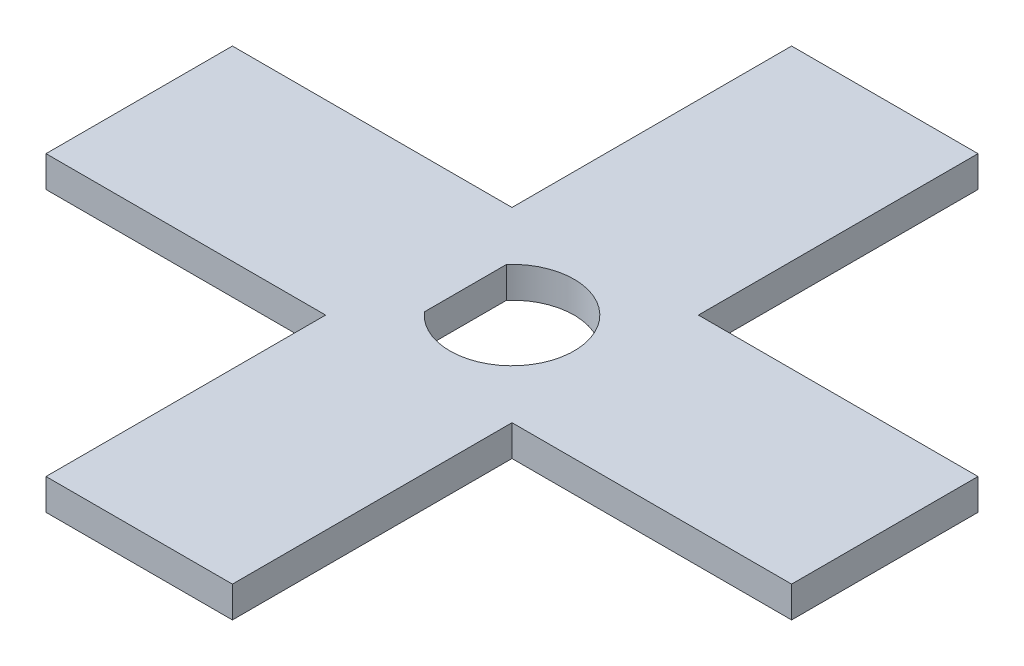
ISO-10303-21;
HEADER;
FILE_DESCRIPTION(('STEP AP214'),'2;1');
FILE_NAME('part.step','',(''),(''),'','','');
FILE_SCHEMA(('AUTOMOTIVE_DESIGN { 1 0 10303 214 1 1 1 1 }'));
ENDSEC;
DATA;
#1=APPLICATION_CONTEXT('core data for automotive mechanical design processes');
#2=APPLICATION_PROTOCOL_DEFINITION('international standard','automotive_design',2000,#1);
#3=PRODUCT_CONTEXT('',#1,'mechanical');
#4=PRODUCT('Part','Part','',(#3));
#5=PRODUCT_RELATED_PRODUCT_CATEGORY('part','',(#4));
#6=PRODUCT_DEFINITION_FORMATION('','',#4);
#7=PRODUCT_DEFINITION_CONTEXT('part definition',#1,'design');
#8=PRODUCT_DEFINITION('design','',#6,#7);
#9=PRODUCT_DEFINITION_SHAPE('','',#8);
#10=(LENGTH_UNIT() NAMED_UNIT(*) SI_UNIT(.MILLI.,.METRE.));
#11=(NAMED_UNIT(*) PLANE_ANGLE_UNIT() SI_UNIT($,.RADIAN.));
#12=(NAMED_UNIT(*) SI_UNIT($,.STERADIAN.) SOLID_ANGLE_UNIT());
#13=UNCERTAINTY_MEASURE_WITH_UNIT(LENGTH_MEASURE(1.E-05),#10,'distance_accuracy_value','');
#14=(GEOMETRIC_REPRESENTATION_CONTEXT(3) GLOBAL_UNCERTAINTY_ASSIGNED_CONTEXT((#13)) GLOBAL_UNIT_ASSIGNED_CONTEXT((#10,
#11,#12)) REPRESENTATION_CONTEXT('',''));
#15=CARTESIAN_POINT('',(0.,0.,0.));
#16=DIRECTION('',(0.,0.,1.));
#17=DIRECTION('',(1.,0.,0.));
#18=AXIS2_PLACEMENT_3D('',#15,#16,#17);
#19=CARTESIAN_POINT('',(0.,2.,0.));
#20=DIRECTION('',(0.,-1.,0.));
#21=DIRECTION('',(0.,0.,-1.));
#22=AXIS2_PLACEMENT_3D('',#19,#20,#21);
#23=PLANE('',#22);
#24=DIRECTION('',(0.,0.,1.));
#25=VECTOR('',#24,1.);
#26=CARTESIAN_POINT('',(24.,2.,-6.));
#27=LINE('',#26,#25);
#28=CARTESIAN_POINT('',(24.,2.,-6.));
#29=VERTEX_POINT('',#28);
#30=CARTESIAN_POINT('',(24.,2.,6.));
#31=VERTEX_POINT('',#30);
#32=EDGE_CURVE('E164',#29,#31,#27,.T.);
#33=ORIENTED_EDGE('',*,*,#32,.F.);
#34=DIRECTION('',(1.,0.,0.));
#35=VECTOR('',#34,1.);
#36=CARTESIAN_POINT('',(6.00000000000001,2.,-6.));
#37=LINE('',#36,#35);
#38=CARTESIAN_POINT('',(6.00000000000001,2.,-6.));
#39=VERTEX_POINT('',#38);
#40=EDGE_CURVE('E209',#39,#29,#37,.T.);
#41=ORIENTED_EDGE('',*,*,#40,.F.);
#42=DIRECTION('',(0.,0.,1.));
#43=VECTOR('',#42,1.);
#44=CARTESIAN_POINT('',(6.,2.,-24.));
#45=LINE('',#44,#43);
#46=CARTESIAN_POINT('',(6.,2.,-24.));
#47=VERTEX_POINT('',#46);
#48=EDGE_CURVE('E205',#47,#39,#45,.T.);
#49=ORIENTED_EDGE('',*,*,#48,.F.);
#50=DIRECTION('',(1.,0.,0.));
#51=VECTOR('',#50,1.);
#52=CARTESIAN_POINT('',(-6.,2.,-24.));
#53=LINE('',#52,#51);
#54=CARTESIAN_POINT('',(-6.,2.,-24.));
#55=VERTEX_POINT('',#54);
#56=EDGE_CURVE('E201',#55,#47,#53,.T.);
#57=ORIENTED_EDGE('',*,*,#56,.F.);
#58=DIRECTION('',(0.,0.,-1.));
#59=VECTOR('',#58,1.);
#60=CARTESIAN_POINT('',(-6.,2.,-6.));
#61=LINE('',#60,#59);
#62=CARTESIAN_POINT('',(-6.,2.,-6.));
#63=VERTEX_POINT('',#62);
#64=EDGE_CURVE('E197',#63,#55,#61,.T.);
#65=ORIENTED_EDGE('',*,*,#64,.F.);
#66=DIRECTION('',(1.,0.,0.));
#67=VECTOR('',#66,1.);
#68=CARTESIAN_POINT('',(-24.,2.,-6.));
#69=LINE('',#68,#67);
#70=CARTESIAN_POINT('',(-24.,2.,-6.));
#71=VERTEX_POINT('',#70);
#72=EDGE_CURVE('E193',#71,#63,#69,.T.);
#73=ORIENTED_EDGE('',*,*,#72,.F.);
#74=DIRECTION('',(0.,0.,-1.));
#75=VECTOR('',#74,1.);
#76=CARTESIAN_POINT('',(-24.,2.,6.));
#77=LINE('',#76,#75);
#78=CARTESIAN_POINT('',(-24.,2.,6.));
#79=VERTEX_POINT('',#78);
#80=EDGE_CURVE('E189',#79,#71,#77,.T.);
#81=ORIENTED_EDGE('',*,*,#80,.F.);
#82=DIRECTION('',(-1.,0.,0.));
#83=VECTOR('',#82,1.);
#84=CARTESIAN_POINT('',(-6.,2.,5.99999999999999));
#85=LINE('',#84,#83);
#86=CARTESIAN_POINT('',(-6.,2.,5.99999999999999));
#87=VERTEX_POINT('',#86);
#88=EDGE_CURVE('E185',#87,#79,#85,.T.);
#89=ORIENTED_EDGE('',*,*,#88,.F.);
#90=DIRECTION('',(0.,0.,-1.));
#91=VECTOR('',#90,1.);
#92=CARTESIAN_POINT('',(-5.99999999999999,2.,24.));
#93=LINE('',#92,#91);
#94=CARTESIAN_POINT('',(-5.99999999999999,2.,24.));
#95=VERTEX_POINT('',#94);
#96=EDGE_CURVE('E181',#95,#87,#93,.T.);
#97=ORIENTED_EDGE('',*,*,#96,.F.);
#98=DIRECTION('',(-1.,0.,0.));
#99=VECTOR('',#98,1.);
#100=CARTESIAN_POINT('',(6.00000000000001,2.,24.));
#101=LINE('',#100,#99);
#102=CARTESIAN_POINT('',(6.00000000000001,2.,24.));
#103=VERTEX_POINT('',#102);
#104=EDGE_CURVE('E177',#103,#95,#101,.T.);
#105=ORIENTED_EDGE('',*,*,#104,.F.);
#106=DIRECTION('',(0.,0.,1.));
#107=VECTOR('',#106,1.);
#108=CARTESIAN_POINT('',(6.00000000000001,2.,6.));
#109=LINE('',#108,#107);
#110=CARTESIAN_POINT('',(6.00000000000001,2.,6.));
#111=VERTEX_POINT('',#110);
#112=EDGE_CURVE('E173',#111,#103,#109,.T.);
#113=ORIENTED_EDGE('',*,*,#112,.F.);
#114=DIRECTION('',(-1.,0.,0.));
#115=VECTOR('',#114,1.);
#116=CARTESIAN_POINT('',(24.,2.,6.));
#117=LINE('',#116,#115);
#118=EDGE_CURVE('E168',#31,#111,#117,.T.);
#119=ORIENTED_EDGE('',*,*,#118,.F.);
#120=EDGE_LOOP('',(#33,#41,#49,#57,#65,#73,#81,#89,#97,#105,#113,#119));
#121=FACE_BOUND('',#120,.T.);
#122=CARTESIAN_POINT('',(0.,2.,0.));
#123=DIRECTION('',(0.,1.,0.));
#124=DIRECTION('',(0.,0.,1.));
#125=AXIS2_PLACEMENT_3D('',#122,#123,#124);
#126=CIRCLE('',#125,4.);
#127=CARTESIAN_POINT('',(-3.,2.,2.64575131106459));
#128=VERTEX_POINT('',#127);
#129=CARTESIAN_POINT('',(-3.,2.,-2.64575131106459));
#130=VERTEX_POINT('',#129);
#131=EDGE_CURVE('E148',#128,#130,#126,.T.);
#132=ORIENTED_EDGE('',*,*,#131,.F.);
#133=DIRECTION('',(0.,0.,1.));
#134=VECTOR('',#133,1.);
#135=CARTESIAN_POINT('',(-3.,2.,2.64575131106459));
#136=LINE('',#135,#134);
#137=EDGE_CURVE('E141',#130,#128,#136,.T.);
#138=ORIENTED_EDGE('',*,*,#137,.F.);
#139=EDGE_LOOP('',(#132,#138));
#140=FACE_BOUND('',#139,.T.);
#141=ADVANCED_FACE('F39',(#121,#140),#23,.F.);
#142=CARTESIAN_POINT('',(0.,0.,0.));
#143=DIRECTION('',(0.,-1.,0.));
#144=DIRECTION('',(0.,0.,-1.));
#145=AXIS2_PLACEMENT_3D('',#142,#143,#144);
#146=PLANE('',#145);
#147=DIRECTION('',(0.,0.,1.));
#148=VECTOR('',#147,1.);
#149=CARTESIAN_POINT('',(24.,0.,-6.));
#150=LINE('',#149,#148);
#151=CARTESIAN_POINT('',(24.,0.,-6.));
#152=VERTEX_POINT('',#151);
#153=CARTESIAN_POINT('',(24.,0.,6.));
#154=VERTEX_POINT('',#153);
#155=EDGE_CURVE('E163',#152,#154,#150,.T.);
#156=ORIENTED_EDGE('',*,*,#155,.T.);
#157=DIRECTION('',(-1.,0.,0.));
#158=VECTOR('',#157,1.);
#159=CARTESIAN_POINT('',(24.,0.,6.));
#160=LINE('',#159,#158);
#161=CARTESIAN_POINT('',(6.00000000000001,0.,6.));
#162=VERTEX_POINT('',#161);
#163=EDGE_CURVE('E216',#154,#162,#160,.T.);
#164=ORIENTED_EDGE('',*,*,#163,.T.);
#165=DIRECTION('',(0.,0.,1.));
#166=VECTOR('',#165,1.);
#167=CARTESIAN_POINT('',(6.00000000000001,0.,6.));
#168=LINE('',#167,#166);
#169=CARTESIAN_POINT('',(6.00000000000001,0.,24.));
#170=VERTEX_POINT('',#169);
#171=EDGE_CURVE('E220',#162,#170,#168,.T.);
#172=ORIENTED_EDGE('',*,*,#171,.T.);
#173=DIRECTION('',(-1.,0.,0.));
#174=VECTOR('',#173,1.);
#175=CARTESIAN_POINT('',(6.00000000000001,0.,24.));
#176=LINE('',#175,#174);
#177=CARTESIAN_POINT('',(-5.99999999999999,0.,24.));
#178=VERTEX_POINT('',#177);
#179=EDGE_CURVE('E224',#170,#178,#176,.T.);
#180=ORIENTED_EDGE('',*,*,#179,.T.);
#181=DIRECTION('',(0.,0.,-1.));
#182=VECTOR('',#181,1.);
#183=CARTESIAN_POINT('',(-5.99999999999999,0.,24.));
#184=LINE('',#183,#182);
#185=CARTESIAN_POINT('',(-6.,0.,5.99999999999999));
#186=VERTEX_POINT('',#185);
#187=EDGE_CURVE('E228',#178,#186,#184,.T.);
#188=ORIENTED_EDGE('',*,*,#187,.T.);
#189=DIRECTION('',(-1.,0.,0.));
#190=VECTOR('',#189,1.);
#191=CARTESIAN_POINT('',(-6.,0.,5.99999999999999));
#192=LINE('',#191,#190);
#193=CARTESIAN_POINT('',(-24.,0.,6.));
#194=VERTEX_POINT('',#193);
#195=EDGE_CURVE('E232',#186,#194,#192,.T.);
#196=ORIENTED_EDGE('',*,*,#195,.T.);
#197=DIRECTION('',(0.,0.,-1.));
#198=VECTOR('',#197,1.);
#199=CARTESIAN_POINT('',(-24.,0.,6.));
#200=LINE('',#199,#198);
#201=CARTESIAN_POINT('',(-24.,0.,-6.));
#202=VERTEX_POINT('',#201);
#203=EDGE_CURVE('E236',#194,#202,#200,.T.);
#204=ORIENTED_EDGE('',*,*,#203,.T.);
#205=DIRECTION('',(1.,0.,0.));
#206=VECTOR('',#205,1.);
#207=CARTESIAN_POINT('',(-24.,0.,-6.));
#208=LINE('',#207,#206);
#209=CARTESIAN_POINT('',(-6.,0.,-6.));
#210=VERTEX_POINT('',#209);
#211=EDGE_CURVE('E240',#202,#210,#208,.T.);
#212=ORIENTED_EDGE('',*,*,#211,.T.);
#213=DIRECTION('',(0.,0.,-1.));
#214=VECTOR('',#213,1.);
#215=CARTESIAN_POINT('',(-6.,0.,-6.));
#216=LINE('',#215,#214);
#217=CARTESIAN_POINT('',(-6.,0.,-24.));
#218=VERTEX_POINT('',#217);
#219=EDGE_CURVE('E244',#210,#218,#216,.T.);
#220=ORIENTED_EDGE('',*,*,#219,.T.);
#221=DIRECTION('',(1.,0.,0.));
#222=VECTOR('',#221,1.);
#223=CARTESIAN_POINT('',(-6.,0.,-24.));
#224=LINE('',#223,#222);
#225=CARTESIAN_POINT('',(6.,0.,-24.));
#226=VERTEX_POINT('',#225);
#227=EDGE_CURVE('E248',#218,#226,#224,.T.);
#228=ORIENTED_EDGE('',*,*,#227,.T.);
#229=DIRECTION('',(0.,0.,1.));
#230=VECTOR('',#229,1.);
#231=CARTESIAN_POINT('',(6.,0.,-24.));
#232=LINE('',#231,#230);
#233=CARTESIAN_POINT('',(6.00000000000001,0.,-6.));
#234=VERTEX_POINT('',#233);
#235=EDGE_CURVE('E252',#226,#234,#232,.T.);
#236=ORIENTED_EDGE('',*,*,#235,.T.);
#237=DIRECTION('',(1.,0.,0.));
#238=VECTOR('',#237,1.);
#239=CARTESIAN_POINT('',(6.00000000000001,0.,-6.));
#240=LINE('',#239,#238);
#241=EDGE_CURVE('E169',#234,#152,#240,.T.);
#242=ORIENTED_EDGE('',*,*,#241,.T.);
#243=EDGE_LOOP('',(#156,#164,#172,#180,#188,#196,#204,#212,#220,#228,#236,#242));
#244=FACE_BOUND('',#243,.T.);
#245=DIRECTION('',(0.,0.,1.));
#246=VECTOR('',#245,1.);
#247=CARTESIAN_POINT('',(-3.,0.,2.64575131106459));
#248=LINE('',#247,#246);
#249=CARTESIAN_POINT('',(-3.,0.,-2.64575131106459));
#250=VERTEX_POINT('',#249);
#251=CARTESIAN_POINT('',(-3.,0.,2.64575131106459));
#252=VERTEX_POINT('',#251);
#253=EDGE_CURVE('E154',#250,#252,#248,.T.);
#254=ORIENTED_EDGE('',*,*,#253,.T.);
#255=CARTESIAN_POINT('',(0.,0.,0.));
#256=DIRECTION('',(0.,1.,0.));
#257=DIRECTION('',(0.,0.,1.));
#258=AXIS2_PLACEMENT_3D('',#255,#256,#257);
#259=CIRCLE('',#258,4.);
#260=EDGE_CURVE('E64',#252,#250,#259,.T.);
#261=ORIENTED_EDGE('',*,*,#260,.T.);
#262=EDGE_LOOP('',(#254,#261));
#263=FACE_BOUND('',#262,.T.);
#264=ADVANCED_FACE('F296',(#244,#263),#146,.T.);
#265=CARTESIAN_POINT('',(24.,2.,-6.));
#266=DIRECTION('',(1.,0.,0.));
#267=DIRECTION('',(0.,0.,-1.));
#268=AXIS2_PLACEMENT_3D('',#265,#266,#267);
#269=PLANE('',#268);
#270=ORIENTED_EDGE('',*,*,#155,.F.);
#271=DIRECTION('',(0.,-1.,0.));
#272=VECTOR('',#271,1.);
#273=CARTESIAN_POINT('',(24.,2.,-6.));
#274=LINE('',#273,#272);
#275=EDGE_CURVE('E11',#29,#152,#274,.T.);
#276=ORIENTED_EDGE('',*,*,#275,.F.);
#277=ORIENTED_EDGE('',*,*,#32,.T.);
#278=DIRECTION('',(0.,-1.,0.));
#279=VECTOR('',#278,1.);
#280=CARTESIAN_POINT('',(24.,2.,6.));
#281=LINE('',#280,#279);
#282=EDGE_CURVE('E43',#31,#154,#281,.T.);
#283=ORIENTED_EDGE('',*,*,#282,.T.);
#284=EDGE_LOOP('',(#270,#276,#277,#283));
#285=FACE_BOUND('',#284,.T.);
#286=ADVANCED_FACE('F41',(#285),#269,.T.);
#287=CARTESIAN_POINT('',(6.00000000000001,2.,-6.));
#288=DIRECTION('',(0.,0.,-1.));
#289=DIRECTION('',(-1.,0.,0.));
#290=AXIS2_PLACEMENT_3D('',#287,#288,#289);
#291=PLANE('',#290);
#292=ORIENTED_EDGE('',*,*,#241,.F.);
#293=DIRECTION('',(0.,-1.,0.));
#294=VECTOR('',#293,1.);
#295=CARTESIAN_POINT('',(6.00000000000001,2.,-6.));
#296=LINE('',#295,#294);
#297=EDGE_CURVE('E49',#39,#234,#296,.T.);
#298=ORIENTED_EDGE('',*,*,#297,.F.);
#299=ORIENTED_EDGE('',*,*,#40,.T.);
#300=ORIENTED_EDGE('',*,*,#275,.T.);
#301=EDGE_LOOP('',(#292,#298,#299,#300));
#302=FACE_BOUND('',#301,.T.);
#303=ADVANCED_FACE('F301',(#302),#291,.T.);
#304=CARTESIAN_POINT('',(6.,2.,-24.));
#305=DIRECTION('',(1.,0.,0.));
#306=DIRECTION('',(0.,0.,-1.));
#307=AXIS2_PLACEMENT_3D('',#304,#305,#306);
#308=PLANE('',#307);
#309=ORIENTED_EDGE('',*,*,#235,.F.);
#310=DIRECTION('',(0.,-1.,0.));
#311=VECTOR('',#310,1.);
#312=CARTESIAN_POINT('',(6.,2.,-24.));
#313=LINE('',#312,#311);
#314=EDGE_CURVE('E261',#47,#226,#313,.T.);
#315=ORIENTED_EDGE('',*,*,#314,.F.);
#316=ORIENTED_EDGE('',*,*,#48,.T.);
#317=ORIENTED_EDGE('',*,*,#297,.T.);
#318=EDGE_LOOP('',(#309,#315,#316,#317));
#319=FACE_BOUND('',#318,.T.);
#320=ADVANCED_FACE('F337',(#319),#308,.T.);
#321=CARTESIAN_POINT('',(-6.,2.,-24.));
#322=DIRECTION('',(0.,0.,-1.));
#323=DIRECTION('',(-1.,0.,0.));
#324=AXIS2_PLACEMENT_3D('',#321,#322,#323);
#325=PLANE('',#324);
#326=ORIENTED_EDGE('',*,*,#227,.F.);
#327=DIRECTION('',(0.,-1.,0.));
#328=VECTOR('',#327,1.);
#329=CARTESIAN_POINT('',(-6.,2.,-24.));
#330=LINE('',#329,#328);
#331=EDGE_CURVE('E264',#55,#218,#330,.T.);
#332=ORIENTED_EDGE('',*,*,#331,.F.);
#333=ORIENTED_EDGE('',*,*,#56,.T.);
#334=ORIENTED_EDGE('',*,*,#314,.T.);
#335=EDGE_LOOP('',(#326,#332,#333,#334));
#336=FACE_BOUND('',#335,.T.);
#337=ADVANCED_FACE('F334',(#336),#325,.T.);
#338=CARTESIAN_POINT('',(-6.,2.,-6.));
#339=DIRECTION('',(-1.,0.,0.));
#340=DIRECTION('',(0.,0.,1.));
#341=AXIS2_PLACEMENT_3D('',#338,#339,#340);
#342=PLANE('',#341);
#343=ORIENTED_EDGE('',*,*,#219,.F.);
#344=DIRECTION('',(0.,-1.,0.));
#345=VECTOR('',#344,1.);
#346=CARTESIAN_POINT('',(-6.,2.,-6.));
#347=LINE('',#346,#345);
#348=EDGE_CURVE('E267',#63,#210,#347,.T.);
#349=ORIENTED_EDGE('',*,*,#348,.F.);
#350=ORIENTED_EDGE('',*,*,#64,.T.);
#351=ORIENTED_EDGE('',*,*,#331,.T.);
#352=EDGE_LOOP('',(#343,#349,#350,#351));
#353=FACE_BOUND('',#352,.T.);
#354=ADVANCED_FACE('F331',(#353),#342,.T.);
#355=CARTESIAN_POINT('',(-24.,2.,-6.));
#356=DIRECTION('',(0.,0.,-1.));
#357=DIRECTION('',(-1.,0.,0.));
#358=AXIS2_PLACEMENT_3D('',#355,#356,#357);
#359=PLANE('',#358);
#360=ORIENTED_EDGE('',*,*,#211,.F.);
#361=DIRECTION('',(0.,-1.,0.));
#362=VECTOR('',#361,1.);
#363=CARTESIAN_POINT('',(-24.,2.,-6.));
#364=LINE('',#363,#362);
#365=EDGE_CURVE('E270',#71,#202,#364,.T.);
#366=ORIENTED_EDGE('',*,*,#365,.F.);
#367=ORIENTED_EDGE('',*,*,#72,.T.);
#368=ORIENTED_EDGE('',*,*,#348,.T.);
#369=EDGE_LOOP('',(#360,#366,#367,#368));
#370=FACE_BOUND('',#369,.T.);
#371=ADVANCED_FACE('F327',(#370),#359,.T.);
#372=CARTESIAN_POINT('',(-24.,2.,6.));
#373=DIRECTION('',(-1.,0.,0.));
#374=DIRECTION('',(0.,0.,1.));
#375=AXIS2_PLACEMENT_3D('',#372,#373,#374);
#376=PLANE('',#375);
#377=ORIENTED_EDGE('',*,*,#203,.F.);
#378=DIRECTION('',(0.,-1.,0.));
#379=VECTOR('',#378,1.);
#380=CARTESIAN_POINT('',(-24.,2.,6.));
#381=LINE('',#380,#379);
#382=EDGE_CURVE('E273',#79,#194,#381,.T.);
#383=ORIENTED_EDGE('',*,*,#382,.F.);
#384=ORIENTED_EDGE('',*,*,#80,.T.);
#385=ORIENTED_EDGE('',*,*,#365,.T.);
#386=EDGE_LOOP('',(#377,#383,#384,#385));
#387=FACE_BOUND('',#386,.T.);
#388=ADVANCED_FACE('F323',(#387),#376,.T.);
#389=CARTESIAN_POINT('',(-6.,2.,5.99999999999999));
#390=DIRECTION('',(0.,0.,1.));
#391=DIRECTION('',(1.,0.,0.));
#392=AXIS2_PLACEMENT_3D('',#389,#390,#391);
#393=PLANE('',#392);
#394=ORIENTED_EDGE('',*,*,#195,.F.);
#395=DIRECTION('',(0.,-1.,0.));
#396=VECTOR('',#395,1.);
#397=CARTESIAN_POINT('',(-6.,2.,5.99999999999999));
#398=LINE('',#397,#396);
#399=EDGE_CURVE('E276',#87,#186,#398,.T.);
#400=ORIENTED_EDGE('',*,*,#399,.F.);
#401=ORIENTED_EDGE('',*,*,#88,.T.);
#402=ORIENTED_EDGE('',*,*,#382,.T.);
#403=EDGE_LOOP('',(#394,#400,#401,#402));
#404=FACE_BOUND('',#403,.T.);
#405=ADVANCED_FACE('F319',(#404),#393,.T.);
#406=CARTESIAN_POINT('',(-5.99999999999999,2.,24.));
#407=DIRECTION('',(-1.,0.,0.));
#408=DIRECTION('',(0.,0.,1.));
#409=AXIS2_PLACEMENT_3D('',#406,#407,#408);
#410=PLANE('',#409);
#411=ORIENTED_EDGE('',*,*,#187,.F.);
#412=DIRECTION('',(0.,-1.,0.));
#413=VECTOR('',#412,1.);
#414=CARTESIAN_POINT('',(-5.99999999999999,2.,24.));
#415=LINE('',#414,#413);
#416=EDGE_CURVE('E279',#95,#178,#415,.T.);
#417=ORIENTED_EDGE('',*,*,#416,.F.);
#418=ORIENTED_EDGE('',*,*,#96,.T.);
#419=ORIENTED_EDGE('',*,*,#399,.T.);
#420=EDGE_LOOP('',(#411,#417,#418,#419));
#421=FACE_BOUND('',#420,.T.);
#422=ADVANCED_FACE('F315',(#421),#410,.T.);
#423=CARTESIAN_POINT('',(6.00000000000001,2.,24.));
#424=DIRECTION('',(0.,0.,1.));
#425=DIRECTION('',(1.,0.,0.));
#426=AXIS2_PLACEMENT_3D('',#423,#424,#425);
#427=PLANE('',#426);
#428=ORIENTED_EDGE('',*,*,#179,.F.);
#429=DIRECTION('',(0.,-1.,0.));
#430=VECTOR('',#429,1.);
#431=CARTESIAN_POINT('',(6.00000000000001,2.,24.));
#432=LINE('',#431,#430);
#433=EDGE_CURVE('E282',#103,#170,#432,.T.);
#434=ORIENTED_EDGE('',*,*,#433,.F.);
#435=ORIENTED_EDGE('',*,*,#104,.T.);
#436=ORIENTED_EDGE('',*,*,#416,.T.);
#437=EDGE_LOOP('',(#428,#434,#435,#436));
#438=FACE_BOUND('',#437,.T.);
#439=ADVANCED_FACE('F313',(#438),#427,.T.);
#440=CARTESIAN_POINT('',(6.00000000000001,2.,6.));
#441=DIRECTION('',(1.,0.,0.));
#442=DIRECTION('',(0.,0.,-1.));
#443=AXIS2_PLACEMENT_3D('',#440,#441,#442);
#444=PLANE('',#443);
#445=ORIENTED_EDGE('',*,*,#171,.F.);
#446=DIRECTION('',(0.,-1.,0.));
#447=VECTOR('',#446,1.);
#448=CARTESIAN_POINT('',(6.00000000000001,2.,6.));
#449=LINE('',#448,#447);
#450=EDGE_CURVE('E284',#111,#162,#449,.T.);
#451=ORIENTED_EDGE('',*,*,#450,.F.);
#452=ORIENTED_EDGE('',*,*,#112,.T.);
#453=ORIENTED_EDGE('',*,*,#433,.T.);
#454=EDGE_LOOP('',(#445,#451,#452,#453));
#455=FACE_BOUND('',#454,.T.);
#456=ADVANCED_FACE('F309',(#455),#444,.T.);
#457=CARTESIAN_POINT('',(24.,2.,6.));
#458=DIRECTION('',(0.,0.,1.));
#459=DIRECTION('',(1.,0.,0.));
#460=AXIS2_PLACEMENT_3D('',#457,#458,#459);
#461=PLANE('',#460);
#462=ORIENTED_EDGE('',*,*,#163,.F.);
#463=ORIENTED_EDGE('',*,*,#282,.F.);
#464=ORIENTED_EDGE('',*,*,#118,.T.);
#465=ORIENTED_EDGE('',*,*,#450,.T.);
#466=EDGE_LOOP('',(#462,#463,#464,#465));
#467=FACE_BOUND('',#466,.T.);
#468=ADVANCED_FACE('F294',(#467),#461,.T.);
#469=CARTESIAN_POINT('',(0.,2.,0.));
#470=DIRECTION('',(0.,-1.,0.));
#471=DIRECTION('',(0.,0.,-1.));
#472=AXIS2_PLACEMENT_3D('',#469,#470,#471);
#473=CYLINDRICAL_SURFACE('',#472,4.);
#474=ORIENTED_EDGE('',*,*,#260,.F.);
#475=DIRECTION('',(0.,-1.,0.));
#476=VECTOR('',#475,1.);
#477=CARTESIAN_POINT('',(-3.,2.,2.64575131106459));
#478=LINE('',#477,#476);
#479=EDGE_CURVE('E143',#128,#252,#478,.T.);
#480=ORIENTED_EDGE('',*,*,#479,.F.);
#481=ORIENTED_EDGE('',*,*,#131,.T.);
#482=DIRECTION('',(0.,-1.,0.));
#483=VECTOR('',#482,1.);
#484=CARTESIAN_POINT('',(-3.,2.,-2.64575131106459));
#485=LINE('',#484,#483);
#486=EDGE_CURVE('E57',#130,#250,#485,.T.);
#487=ORIENTED_EDGE('',*,*,#486,.T.);
#488=EDGE_LOOP('',(#474,#480,#481,#487));
#489=FACE_BOUND('',#488,.T.);
#490=ADVANCED_FACE('F150',(#489),#473,.F.);
#491=CARTESIAN_POINT('',(-3.,2.,2.64575131106459));
#492=DIRECTION('',(1.,0.,0.));
#493=DIRECTION('',(0.,0.,-1.));
#494=AXIS2_PLACEMENT_3D('',#491,#492,#493);
#495=PLANE('',#494);
#496=ORIENTED_EDGE('',*,*,#253,.F.);
#497=ORIENTED_EDGE('',*,*,#486,.F.);
#498=ORIENTED_EDGE('',*,*,#137,.T.);
#499=ORIENTED_EDGE('',*,*,#479,.T.);
#500=EDGE_LOOP('',(#496,#497,#498,#499));
#501=FACE_BOUND('',#500,.T.);
#502=ADVANCED_FACE('F142',(#501),#495,.T.);
#503=CLOSED_SHELL('',(#141,#264,#286,#303,#320,#337,#354,#371,#388,#405,#422,#439,#456,#468,
#490,#502));
#504=MANIFOLD_SOLID_BREP('B2',#503);
#505=ADVANCED_BREP_SHAPE_REPRESENTATION('',(#18,#504),#14);
#506=SHAPE_DEFINITION_REPRESENTATION(#9,#505);
ENDSEC;
END-ISO-10303-21;
